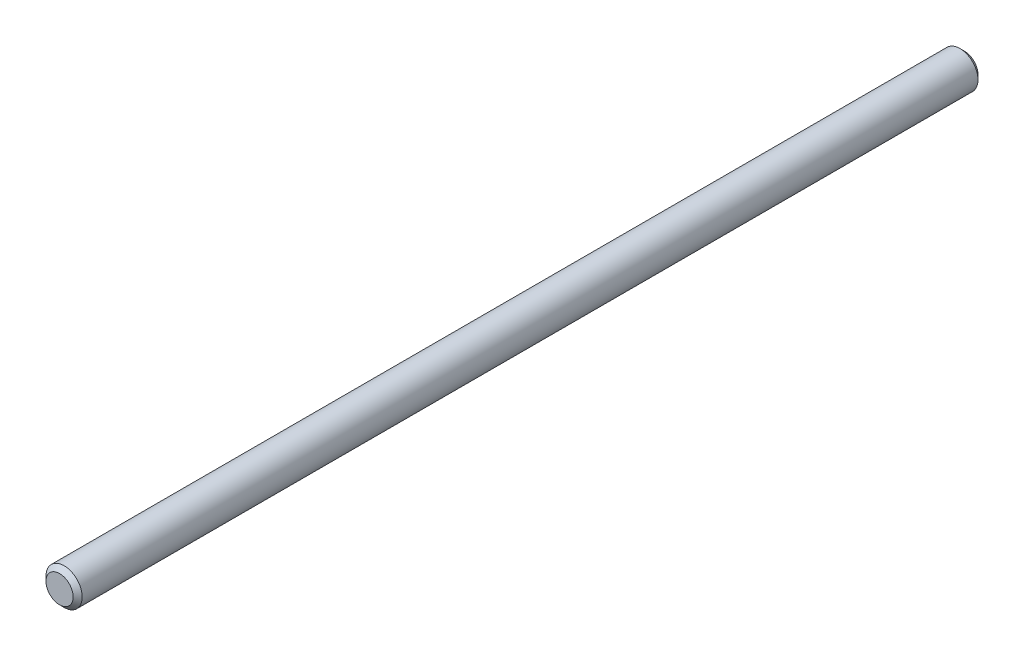
ISO-10303-21;
HEADER;
FILE_DESCRIPTION(('STEP AP214'),'2;1');
FILE_NAME('part.step','',(''),(''),'','','');
FILE_SCHEMA(('AUTOMOTIVE_DESIGN { 1 0 10303 214 1 1 1 1 }'));
ENDSEC;
DATA;
#1=APPLICATION_CONTEXT('core data for automotive mechanical design processes');
#2=APPLICATION_PROTOCOL_DEFINITION('international standard','automotive_design',2000,#1);
#3=PRODUCT_CONTEXT('',#1,'mechanical');
#4=PRODUCT('Part','Part','',(#3));
#5=PRODUCT_RELATED_PRODUCT_CATEGORY('part','',(#4));
#6=PRODUCT_DEFINITION_FORMATION('','',#4);
#7=PRODUCT_DEFINITION_CONTEXT('part definition',#1,'design');
#8=PRODUCT_DEFINITION('design','',#6,#7);
#9=PRODUCT_DEFINITION_SHAPE('','',#8);
#10=(LENGTH_UNIT() NAMED_UNIT(*) SI_UNIT(.MILLI.,.METRE.));
#11=(NAMED_UNIT(*) PLANE_ANGLE_UNIT() SI_UNIT($,.RADIAN.));
#12=(NAMED_UNIT(*) SI_UNIT($,.STERADIAN.) SOLID_ANGLE_UNIT());
#13=UNCERTAINTY_MEASURE_WITH_UNIT(LENGTH_MEASURE(1.E-05),#10,'distance_accuracy_value','');
#14=(GEOMETRIC_REPRESENTATION_CONTEXT(3) GLOBAL_UNCERTAINTY_ASSIGNED_CONTEXT((#13)) GLOBAL_UNIT_ASSIGNED_CONTEXT((#10,
#11,#12)) REPRESENTATION_CONTEXT('',''));
#15=CARTESIAN_POINT('',(0.,0.,0.));
#16=DIRECTION('',(0.,0.,1.));
#17=DIRECTION('',(1.,0.,0.));
#18=AXIS2_PLACEMENT_3D('',#15,#16,#17);
#19=CARTESIAN_POINT('',(0.,0.,100.));
#20=DIRECTION('',(0.,0.,-1.));
#21=DIRECTION('',(-1.,0.,0.));
#22=AXIS2_PLACEMENT_3D('',#19,#20,#21);
#23=CYLINDRICAL_SURFACE('',#22,2.);
#24=CARTESIAN_POINT('',(0.,0.,0.500000000000014));
#25=DIRECTION('',(0.,0.,1.));
#26=DIRECTION('',(1.,0.,0.));
#27=AXIS2_PLACEMENT_3D('',#24,#25,#26);
#28=CIRCLE('',#27,2.);
#29=CARTESIAN_POINT('',(2.,0.,0.500000000000014));
#30=VERTEX_POINT('',#29);
#31=EDGE_CURVE('E42',#30,#30,#28,.T.);
#32=ORIENTED_EDGE('',*,*,#31,.T.);
#33=EDGE_LOOP('',(#32));
#34=FACE_BOUND('',#33,.T.);
#35=CARTESIAN_POINT('',(0.,0.,99.5));
#36=DIRECTION('',(0.,0.,1.));
#37=DIRECTION('',(1.,0.,0.));
#38=AXIS2_PLACEMENT_3D('',#35,#36,#37);
#39=CIRCLE('',#38,2.);
#40=CARTESIAN_POINT('',(2.,0.,99.5));
#41=VERTEX_POINT('',#40);
#42=EDGE_CURVE('E46',#41,#41,#39,.F.);
#43=ORIENTED_EDGE('',*,*,#42,.T.);
#44=EDGE_LOOP('',(#43));
#45=FACE_BOUND('',#44,.T.);
#46=ADVANCED_FACE('F31',(#34,#45),#23,.T.);
#47=CARTESIAN_POINT('',(0.,0.,100.));
#48=DIRECTION('',(0.,0.,1.));
#49=DIRECTION('',(1.,0.,0.));
#50=AXIS2_PLACEMENT_3D('',#47,#48,#49);
#51=PLANE('',#50);
#52=CARTESIAN_POINT('',(0.,0.,100.));
#53=DIRECTION('',(0.,0.,1.));
#54=DIRECTION('',(1.,0.,0.));
#55=AXIS2_PLACEMENT_3D('',#52,#53,#54);
#56=CIRCLE('',#55,1.50000000000003);
#57=CARTESIAN_POINT('',(1.50000000000003,0.,100.));
#58=VERTEX_POINT('',#57);
#59=EDGE_CURVE('E10',#58,#58,#56,.T.);
#60=ORIENTED_EDGE('',*,*,#59,.T.);
#61=EDGE_LOOP('',(#60));
#62=FACE_BOUND('',#61,.T.);
#63=ADVANCED_FACE('F62',(#62),#51,.T.);
#64=CARTESIAN_POINT('',(0.,0.,0.));
#65=DIRECTION('',(0.,0.,1.));
#66=DIRECTION('',(1.,0.,0.));
#67=AXIS2_PLACEMENT_3D('',#64,#65,#66);
#68=PLANE('',#67);
#69=CARTESIAN_POINT('',(0.,0.,0.));
#70=DIRECTION('',(0.,0.,1.));
#71=DIRECTION('',(1.,0.,0.));
#72=AXIS2_PLACEMENT_3D('',#69,#70,#71);
#73=CIRCLE('',#72,1.49999999999997);
#74=CARTESIAN_POINT('',(1.49999999999997,0.,0.));
#75=VERTEX_POINT('',#74);
#76=EDGE_CURVE('E38',#75,#75,#73,.F.);
#77=ORIENTED_EDGE('',*,*,#76,.T.);
#78=EDGE_LOOP('',(#77));
#79=FACE_BOUND('',#78,.T.);
#80=ADVANCED_FACE('F59',(#79),#68,.F.);
#81=CARTESIAN_POINT('',(0.,0.,0.500000000000014));
#82=DIRECTION('',(0.,0.,1.));
#83=DIRECTION('',(1.,0.,0.));
#84=AXIS2_PLACEMENT_3D('',#81,#82,#83);
#85=CONICAL_SURFACE('',#84,2.,0.78539816339746);
#86=ORIENTED_EDGE('',*,*,#76,.F.);
#87=EDGE_LOOP('',(#86));
#88=FACE_BOUND('',#87,.T.);
#89=ORIENTED_EDGE('',*,*,#31,.F.);
#90=EDGE_LOOP('',(#89));
#91=FACE_BOUND('',#90,.T.);
#92=ADVANCED_FACE('F55',(#88,#91),#85,.T.);
#93=CARTESIAN_POINT('',(0.,0.,100.));
#94=DIRECTION('',(0.,0.,-1.));
#95=DIRECTION('',(-1.,0.,0.));
#96=AXIS2_PLACEMENT_3D('',#93,#94,#95);
#97=CONICAL_SURFACE('',#96,1.50000000000003,0.785398163397447);
#98=ORIENTED_EDGE('',*,*,#42,.F.);
#99=EDGE_LOOP('',(#98));
#100=FACE_BOUND('',#99,.T.);
#101=ORIENTED_EDGE('',*,*,#59,.F.);
#102=EDGE_LOOP('',(#101));
#103=FACE_BOUND('',#102,.T.);
#104=ADVANCED_FACE('F33',(#100,#103),#97,.T.);
#105=CLOSED_SHELL('',(#46,#63,#80,#92,#104));
#106=MANIFOLD_SOLID_BREP('B2',#105);
#107=ADVANCED_BREP_SHAPE_REPRESENTATION('',(#18,#106),#14);
#108=SHAPE_DEFINITION_REPRESENTATION(#9,#107);
ENDSEC;
END-ISO-10303-21;
